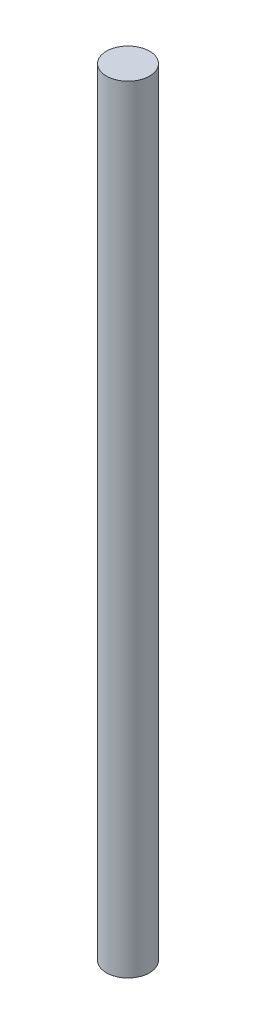
ISO-10303-21;
HEADER;
FILE_DESCRIPTION(('STEP AP214'),'2;1');
FILE_NAME('part.step','',(''),(''),'','','');
FILE_SCHEMA(('AUTOMOTIVE_DESIGN { 1 0 10303 214 1 1 1 1 }'));
ENDSEC;
DATA;
#1=APPLICATION_CONTEXT('core data for automotive mechanical design processes');
#2=APPLICATION_PROTOCOL_DEFINITION('international standard','automotive_design',2000,#1);
#3=PRODUCT_CONTEXT('',#1,'mechanical');
#4=PRODUCT('Part','Part','',(#3));
#5=PRODUCT_RELATED_PRODUCT_CATEGORY('part','',(#4));
#6=PRODUCT_DEFINITION_FORMATION('','',#4);
#7=PRODUCT_DEFINITION_CONTEXT('part definition',#1,'design');
#8=PRODUCT_DEFINITION('design','',#6,#7);
#9=PRODUCT_DEFINITION_SHAPE('','',#8);
#10=(LENGTH_UNIT() NAMED_UNIT(*) SI_UNIT(.MILLI.,.METRE.));
#11=(NAMED_UNIT(*) PLANE_ANGLE_UNIT() SI_UNIT($,.RADIAN.));
#12=(NAMED_UNIT(*) SI_UNIT($,.STERADIAN.) SOLID_ANGLE_UNIT());
#13=UNCERTAINTY_MEASURE_WITH_UNIT(LENGTH_MEASURE(1.E-05),#10,'distance_accuracy_value','');
#14=(GEOMETRIC_REPRESENTATION_CONTEXT(3) GLOBAL_UNCERTAINTY_ASSIGNED_CONTEXT((#13)) GLOBAL_UNIT_ASSIGNED_CONTEXT((#10,
#11,#12)) REPRESENTATION_CONTEXT('',''));
#15=CARTESIAN_POINT('',(0.,0.,0.));
#16=DIRECTION('',(0.,0.,1.));
#17=DIRECTION('',(1.,0.,0.));
#18=AXIS2_PLACEMENT_3D('',#15,#16,#17);
#19=CARTESIAN_POINT('',(0.,36.,0.));
#20=DIRECTION('',(0.,-1.,0.));
#21=DIRECTION('',(0.,0.,-1.));
#22=AXIS2_PLACEMENT_3D('',#19,#20,#21);
#23=CYLINDRICAL_SURFACE('',#22,1.);
#24=CARTESIAN_POINT('',(0.,36.,0.));
#25=DIRECTION('',(0.,1.,0.));
#26=DIRECTION('',(0.,0.,1.));
#27=AXIS2_PLACEMENT_3D('',#24,#25,#26);
#28=CIRCLE('',#27,1.);
#29=CARTESIAN_POINT('',(0.,36.,1.));
#30=VERTEX_POINT('',#29);
#31=EDGE_CURVE('E10',#30,#30,#28,.T.);
#32=ORIENTED_EDGE('',*,*,#31,.F.);
#33=EDGE_LOOP('',(#32));
#34=FACE_BOUND('',#33,.T.);
#35=CARTESIAN_POINT('',(0.,0.,0.));
#36=DIRECTION('',(0.,1.,0.));
#37=DIRECTION('',(0.,0.,1.));
#38=AXIS2_PLACEMENT_3D('',#35,#36,#37);
#39=CIRCLE('',#38,1.);
#40=CARTESIAN_POINT('',(0.,0.,1.));
#41=VERTEX_POINT('',#40);
#42=EDGE_CURVE('E42',#41,#41,#39,.T.);
#43=ORIENTED_EDGE('',*,*,#42,.T.);
#44=EDGE_LOOP('',(#43));
#45=FACE_BOUND('',#44,.T.);
#46=ADVANCED_FACE('F39',(#34,#45),#23,.T.);
#47=CARTESIAN_POINT('',(0.,36.,0.));
#48=DIRECTION('',(0.,1.,0.));
#49=DIRECTION('',(0.,0.,1.));
#50=AXIS2_PLACEMENT_3D('',#47,#48,#49);
#51=PLANE('',#50);
#52=ORIENTED_EDGE('',*,*,#31,.T.);
#53=EDGE_LOOP('',(#52));
#54=FACE_BOUND('',#53,.T.);
#55=ADVANCED_FACE('F54',(#54),#51,.T.);
#56=CARTESIAN_POINT('',(0.,0.,0.));
#57=DIRECTION('',(0.,1.,0.));
#58=DIRECTION('',(0.,0.,1.));
#59=AXIS2_PLACEMENT_3D('',#56,#57,#58);
#60=PLANE('',#59);
#61=ORIENTED_EDGE('',*,*,#42,.F.);
#62=EDGE_LOOP('',(#61));
#63=FACE_BOUND('',#62,.T.);
#64=ADVANCED_FACE('F52',(#63),#60,.F.);
#65=CLOSED_SHELL('',(#46,#55,#64));
#66=MANIFOLD_SOLID_BREP('B2',#65);
#67=ADVANCED_BREP_SHAPE_REPRESENTATION('',(#18,#66),#14);
#68=SHAPE_DEFINITION_REPRESENTATION(#9,#67);
ENDSEC;
END-ISO-10303-21;
